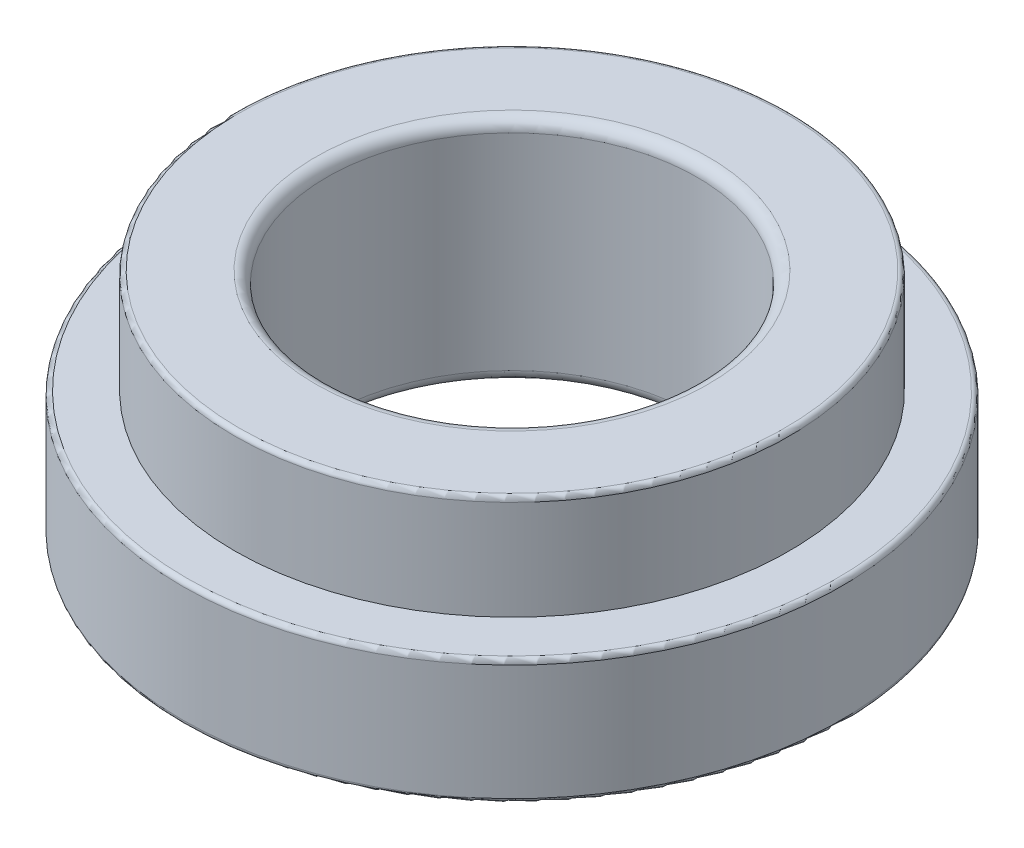
ISO-10303-21;
HEADER;
FILE_DESCRIPTION(('STEP AP214'),'2;1');
FILE_NAME('part.step','',(''),(''),'','','');
FILE_SCHEMA(('AUTOMOTIVE_DESIGN { 1 0 10303 214 1 1 1 1 }'));
ENDSEC;
DATA;
#1=APPLICATION_CONTEXT('core data for automotive mechanical design processes');
#2=APPLICATION_PROTOCOL_DEFINITION('international standard','automotive_design',2000,#1);
#3=PRODUCT_CONTEXT('',#1,'mechanical');
#4=PRODUCT('Part','Part','',(#3));
#5=PRODUCT_RELATED_PRODUCT_CATEGORY('part','',(#4));
#6=PRODUCT_DEFINITION_FORMATION('','',#4);
#7=PRODUCT_DEFINITION_CONTEXT('part definition',#1,'design');
#8=PRODUCT_DEFINITION('design','',#6,#7);
#9=PRODUCT_DEFINITION_SHAPE('','',#8);
#10=(LENGTH_UNIT() NAMED_UNIT(*) SI_UNIT(.MILLI.,.METRE.));
#11=(NAMED_UNIT(*) PLANE_ANGLE_UNIT() SI_UNIT($,.RADIAN.));
#12=(NAMED_UNIT(*) SI_UNIT($,.STERADIAN.) SOLID_ANGLE_UNIT());
#13=UNCERTAINTY_MEASURE_WITH_UNIT(LENGTH_MEASURE(1.E-05),#10,'distance_accuracy_value','');
#14=(GEOMETRIC_REPRESENTATION_CONTEXT(3) GLOBAL_UNCERTAINTY_ASSIGNED_CONTEXT((#13)) GLOBAL_UNIT_ASSIGNED_CONTEXT((#10,
#11,#12)) REPRESENTATION_CONTEXT('',''));
#15=CARTESIAN_POINT('',(0.,0.,0.));
#16=DIRECTION('',(0.,0.,1.));
#17=DIRECTION('',(1.,0.,0.));
#18=AXIS2_PLACEMENT_3D('',#15,#16,#17);
#19=CARTESIAN_POINT('',(0.,4.95,0.));
#20=DIRECTION('',(0.,-1.,0.));
#21=DIRECTION('',(0.,0.,-1.));
#22=AXIS2_PLACEMENT_3D('',#19,#20,#21);
#23=CYLINDRICAL_SURFACE('',#22,7.125);
#24=CARTESIAN_POINT('',(0.,2.6,0.));
#25=DIRECTION('',(0.,1.,0.));
#26=DIRECTION('',(0.,0.,1.));
#27=AXIS2_PLACEMENT_3D('',#24,#25,#26);
#28=CIRCLE('',#27,7.125);
#29=CARTESIAN_POINT('',(0.,2.6,-7.125));
#30=VERTEX_POINT('',#29);
#31=EDGE_CURVE('E62',#30,#30,#28,.F.);
#32=CARTESIAN_POINT('',(0.,0.1,0.));
#33=DIRECTION('',(0.,1.,0.));
#34=DIRECTION('',(0.,0.,1.));
#35=AXIS2_PLACEMENT_3D('',#32,#33,#34);
#36=CIRCLE('',#35,7.125);
#37=CARTESIAN_POINT('',(0.,0.0999999999999994,-7.125));
#38=VERTEX_POINT('',#37);
#39=EDGE_CURVE('E65',#38,#38,#36,.T.);
#40=CARTESIAN_POINT('',(0.,2.6,-7.125));
#41=CARTESIAN_POINT('',(0.,2.57395833333333,-7.125));
#42=CARTESIAN_POINT('',(0.,2.54791666666667,-7.125));
#43=CARTESIAN_POINT('',(0.,2.49583333333333,-7.125));
#44=CARTESIAN_POINT('',(0.,2.46979166666667,-7.125));
#45=CARTESIAN_POINT('',(0.,2.41770833333333,-7.125));
#46=CARTESIAN_POINT('',(0.,2.39166666666667,-7.125));
#47=CARTESIAN_POINT('',(0.,2.33958333333333,-7.125));
#48=CARTESIAN_POINT('',(0.,2.31354166666667,-7.125));
#49=CARTESIAN_POINT('',(0.,2.26145833333333,-7.125));
#50=CARTESIAN_POINT('',(0.,2.23541666666667,-7.125));
#51=CARTESIAN_POINT('',(0.,2.18333333333333,-7.125));
#52=CARTESIAN_POINT('',(0.,2.15729166666667,-7.125));
#53=CARTESIAN_POINT('',(0.,2.10520833333333,-7.125));
#54=CARTESIAN_POINT('',(0.,2.07916666666667,-7.125));
#55=CARTESIAN_POINT('',(0.,2.02708333333333,-7.125));
#56=CARTESIAN_POINT('',(0.,2.00104166666667,-7.125));
#57=CARTESIAN_POINT('',(0.,1.94895833333333,-7.125));
#58=CARTESIAN_POINT('',(0.,1.92291666666667,-7.125));
#59=CARTESIAN_POINT('',(0.,1.87083333333333,-7.125));
#60=CARTESIAN_POINT('',(0.,1.84479166666667,-7.125));
#61=CARTESIAN_POINT('',(0.,1.79270833333333,-7.125));
#62=CARTESIAN_POINT('',(0.,1.76666666666667,-7.125));
#63=CARTESIAN_POINT('',(0.,1.71458333333333,-7.125));
#64=CARTESIAN_POINT('',(0.,1.68854166666667,-7.125));
#65=CARTESIAN_POINT('',(0.,1.63645833333333,-7.125));
#66=CARTESIAN_POINT('',(0.,1.61041666666667,-7.125));
#67=CARTESIAN_POINT('',(0.,1.55833333333333,-7.125));
#68=CARTESIAN_POINT('',(0.,1.53229166666667,-7.125));
#69=CARTESIAN_POINT('',(0.,1.48020833333333,-7.125));
#70=CARTESIAN_POINT('',(0.,1.45416666666667,-7.125));
#71=CARTESIAN_POINT('',(0.,1.40208333333333,-7.125));
#72=CARTESIAN_POINT('',(0.,1.37604166666667,-7.125));
#73=CARTESIAN_POINT('',(0.,1.32395833333333,-7.125));
#74=CARTESIAN_POINT('',(0.,1.29791666666667,-7.125));
#75=CARTESIAN_POINT('',(0.,1.24583333333333,-7.125));
#76=CARTESIAN_POINT('',(0.,1.21979166666667,-7.125));
#77=CARTESIAN_POINT('',(0.,1.16770833333333,-7.125));
#78=CARTESIAN_POINT('',(0.,1.14166666666667,-7.125));
#79=CARTESIAN_POINT('',(0.,1.08958333333333,-7.125));
#80=CARTESIAN_POINT('',(0.,1.06354166666667,-7.125));
#81=CARTESIAN_POINT('',(0.,1.01145833333333,-7.125));
#82=CARTESIAN_POINT('',(0.,0.985416666666667,-7.125));
#83=CARTESIAN_POINT('',(0.,0.933333333333333,-7.125));
#84=CARTESIAN_POINT('',(0.,0.907291666666667,-7.125));
#85=CARTESIAN_POINT('',(0.,0.855208333333333,-7.125));
#86=CARTESIAN_POINT('',(0.,0.829166666666667,-7.125));
#87=CARTESIAN_POINT('',(0.,0.777083333333333,-7.125));
#88=CARTESIAN_POINT('',(0.,0.751041666666667,-7.125));
#89=CARTESIAN_POINT('',(0.,0.698958333333333,-7.125));
#90=CARTESIAN_POINT('',(0.,0.672916666666667,-7.125));
#91=CARTESIAN_POINT('',(0.,0.620833333333333,-7.125));
#92=CARTESIAN_POINT('',(0.,0.594791666666666,-7.125));
#93=CARTESIAN_POINT('',(0.,0.542708333333333,-7.125));
#94=CARTESIAN_POINT('',(0.,0.516666666666666,-7.125));
#95=CARTESIAN_POINT('',(0.,0.464583333333333,-7.125));
#96=CARTESIAN_POINT('',(0.,0.438541666666666,-7.125));
#97=CARTESIAN_POINT('',(0.,0.386458333333333,-7.125));
#98=CARTESIAN_POINT('',(0.,0.360416666666666,-7.125));
#99=CARTESIAN_POINT('',(0.,0.308333333333333,-7.125));
#100=CARTESIAN_POINT('',(0.,0.282291666666666,-7.125));
#101=CARTESIAN_POINT('',(0.,0.230208333333333,-7.125));
#102=CARTESIAN_POINT('',(0.,0.204166666666666,-7.125));
#103=CARTESIAN_POINT('',(0.,0.152083333333333,-7.125));
#104=CARTESIAN_POINT('',(0.,0.126041666666666,-7.125));
#105=CARTESIAN_POINT('',(0.,0.0999999999999994,-7.125));
#106=B_SPLINE_CURVE_WITH_KNOTS('',3,(#40,#41,#42,#43,#44,#45,#46,#47,#48,#49,#50,#51,#52,#53,
#54,#55,#56,#57,#58,#59,#60,#61,#62,#63,#64,#65,#66,#67,#68,#69,#70,#71,#72,#73,#74,#75,#76,#77,
#78,#79,#80,#81,#82,#83,#84,#85,#86,#87,#88,#89,#90,#91,#92,#93,#94,#95,#96,#97,#98,#99,#100,
#101,#102,#103,#104,#105),.UNSPECIFIED.,.F.,.F.,(4,2,2,2,2,2,2,2,2,2,2,2,2,2,2,2,2,2,2,2,2,2,2,
2,2,2,2,2,2,2,2,2,4),(0.,0.0781250000000001,0.15625,0.234375,0.3125,0.390625,0.46875,0.546875,
0.625000000000001,0.703125000000001,0.781250000000001,0.859375,0.9375,1.015625,1.09375,1.171875,
1.25,1.328125,1.40625,1.484375,1.5625,1.640625,1.71875,1.796875,1.875,1.953125,2.03125,2.109375,
2.1875,2.265625,2.34375,2.421875,2.5),.UNSPECIFIED.);
#107=EDGE_CURVE('BSEAM39',#30,#38,#106,.T.);
#108=ORIENTED_EDGE('',*,*,#31,.T.);
#109=ORIENTED_EDGE('',*,*,#39,.T.);
#110=ORIENTED_EDGE('',*,*,#107,.T.);
#111=ORIENTED_EDGE('',*,*,#107,.F.);
#112=EDGE_LOOP('',(#108,#110,#109,#111));
#113=FACE_BOUND('',#112,.T.);
#114=ADVANCED_FACE('F39',(#113),#23,.T.);
#115=CARTESIAN_POINT('',(0.,4.95,0.));
#116=DIRECTION('',(0.,1.,0.));
#117=DIRECTION('',(0.,0.,1.));
#118=AXIS2_PLACEMENT_3D('',#115,#116,#117);
#119=PLANE('',#118);
#120=CARTESIAN_POINT('',(0.,4.95,0.));
#121=DIRECTION('',(0.,1.,0.));
#122=DIRECTION('',(0.,0.,1.));
#123=AXIS2_PLACEMENT_3D('',#120,#121,#122);
#124=CIRCLE('',#123,4.25);
#125=CARTESIAN_POINT('',(0.,4.95,4.25));
#126=VERTEX_POINT('',#125);
#127=EDGE_CURVE('E46',#126,#126,#124,.F.);
#128=ORIENTED_EDGE('',*,*,#127,.T.);
#129=EDGE_LOOP('',(#128));
#130=FACE_BOUND('',#129,.T.);
#131=CARTESIAN_POINT('',(0.,4.95,0.));
#132=DIRECTION('',(0.,1.,0.));
#133=DIRECTION('',(0.,0.,1.));
#134=AXIS2_PLACEMENT_3D('',#131,#132,#133);
#135=CIRCLE('',#134,5.89881953293693);
#136=CARTESIAN_POINT('',(0.,4.95,5.89881953293693));
#137=VERTEX_POINT('',#136);
#138=EDGE_CURVE('E74',#137,#137,#135,.T.);
#139=ORIENTED_EDGE('',*,*,#138,.T.);
#140=EDGE_LOOP('',(#139));
#141=FACE_BOUND('',#140,.T.);
#142=ADVANCED_FACE('F99',(#130,#141),#119,.T.);
#143=CARTESIAN_POINT('',(0.,0.,0.));
#144=DIRECTION('',(0.,1.,0.));
#145=DIRECTION('',(0.,0.,1.));
#146=AXIS2_PLACEMENT_3D('',#143,#144,#145);
#147=PLANE('',#146);
#148=CARTESIAN_POINT('',(0.,0.,0.));
#149=DIRECTION('',(0.,1.,0.));
#150=DIRECTION('',(0.,0.,1.));
#151=AXIS2_PLACEMENT_3D('',#148,#149,#150);
#152=CIRCLE('',#151,4.25);
#153=CARTESIAN_POINT('',(0.,0.,4.25));
#154=VERTEX_POINT('',#153);
#155=EDGE_CURVE('E10',#154,#154,#152,.T.);
#156=ORIENTED_EDGE('',*,*,#155,.T.);
#157=EDGE_LOOP('',(#156));
#158=FACE_BOUND('',#157,.T.);
#159=CARTESIAN_POINT('',(0.,0.,0.));
#160=DIRECTION('',(0.,1.,0.));
#161=DIRECTION('',(0.,0.,1.));
#162=AXIS2_PLACEMENT_3D('',#159,#160,#161);
#163=CIRCLE('',#162,7.025);
#164=CARTESIAN_POINT('',(0.,0.,7.025));
#165=VERTEX_POINT('',#164);
#166=EDGE_CURVE('E59',#165,#165,#163,.F.);
#167=ORIENTED_EDGE('',*,*,#166,.T.);
#168=EDGE_LOOP('',(#167));
#169=FACE_BOUND('',#168,.T.);
#170=ADVANCED_FACE('F96',(#158,#169),#147,.F.);
#171=CARTESIAN_POINT('',(0.,-7.3,0.));
#172=DIRECTION('',(0.,1.,0.));
#173=DIRECTION('',(0.,0.,1.));
#174=AXIS2_PLACEMENT_3D('',#171,#172,#173);
#175=CYLINDRICAL_SURFACE('',#174,4.);
#176=CARTESIAN_POINT('',(0.,4.7,0.));
#177=DIRECTION('',(0.,1.,0.));
#178=DIRECTION('',(0.,0.,1.));
#179=AXIS2_PLACEMENT_3D('',#176,#177,#178);
#180=CIRCLE('',#179,4.);
#181=CARTESIAN_POINT('',(0.,4.7,4.));
#182=VERTEX_POINT('',#181);
#183=EDGE_CURVE('E50',#182,#182,#180,.T.);
#184=ORIENTED_EDGE('',*,*,#183,.T.);
#185=EDGE_LOOP('',(#184));
#186=FACE_BOUND('',#185,.T.);
#187=CARTESIAN_POINT('',(0.,0.25,0.));
#188=DIRECTION('',(0.,1.,0.));
#189=DIRECTION('',(0.,0.,1.));
#190=AXIS2_PLACEMENT_3D('',#187,#188,#189);
#191=CIRCLE('',#190,4.);
#192=CARTESIAN_POINT('',(0.,0.25,4.));
#193=VERTEX_POINT('',#192);
#194=EDGE_CURVE('E54',#193,#193,#191,.F.);
#195=ORIENTED_EDGE('',*,*,#194,.T.);
#196=EDGE_LOOP('',(#195));
#197=FACE_BOUND('',#196,.T.);
#198=ADVANCED_FACE('F85',(#186,#197),#175,.F.);
#199=CARTESIAN_POINT('',(0.,2.7,0.));
#200=DIRECTION('',(0.,1.,0.));
#201=DIRECTION('',(0.,0.,1.));
#202=AXIS2_PLACEMENT_3D('',#199,#200,#201);
#203=PLANE('',#202);
#204=CARTESIAN_POINT('',(0.,2.7,0.));
#205=DIRECTION('',(0.,1.,0.));
#206=DIRECTION('',(0.,0.,1.));
#207=AXIS2_PLACEMENT_3D('',#204,#205,#206);
#208=CIRCLE('',#207,7.025);
#209=CARTESIAN_POINT('',(0.,2.7,7.025));
#210=VERTEX_POINT('',#209);
#211=EDGE_CURVE('E68',#210,#210,#208,.T.);
#212=ORIENTED_EDGE('',*,*,#211,.T.);
#213=EDGE_LOOP('',(#212));
#214=FACE_BOUND('',#213,.T.);
#215=CARTESIAN_POINT('',(0.,2.7,0.));
#216=DIRECTION('',(0.,1.,0.));
#217=DIRECTION('',(0.,0.,1.));
#218=AXIS2_PLACEMENT_3D('',#215,#216,#217);
#219=CIRCLE('',#218,5.99881953293693);
#220=CARTESIAN_POINT('',(0.,2.7,5.99881953293693));
#221=VERTEX_POINT('',#220);
#222=EDGE_CURVE('E77',#221,#221,#219,.T.);
#223=ORIENTED_EDGE('',*,*,#222,.F.);
#224=EDGE_LOOP('',(#223));
#225=FACE_BOUND('',#224,.T.);
#226=ADVANCED_FACE('F83',(#214,#225),#203,.T.);
#227=CARTESIAN_POINT('',(0.,2.7,0.));
#228=DIRECTION('',(0.,1.,0.));
#229=DIRECTION('',(0.,0.,1.));
#230=AXIS2_PLACEMENT_3D('',#227,#228,#229);
#231=CYLINDRICAL_SURFACE('',#230,5.99881953293693);
#232=CARTESIAN_POINT('',(0.,4.85,0.));
#233=DIRECTION('',(0.,1.,0.));
#234=DIRECTION('',(0.,0.,1.));
#235=AXIS2_PLACEMENT_3D('',#232,#233,#234);
#236=CIRCLE('',#235,5.99881953293693);
#237=CARTESIAN_POINT('',(0.,4.85,5.99881953293693));
#238=VERTEX_POINT('',#237);
#239=EDGE_CURVE('E71',#238,#238,#236,.F.);
#240=ORIENTED_EDGE('',*,*,#239,.T.);
#241=EDGE_LOOP('',(#240));
#242=FACE_BOUND('',#241,.T.);
#243=ORIENTED_EDGE('',*,*,#222,.T.);
#244=EDGE_LOOP('',(#243));
#245=FACE_BOUND('',#244,.T.);
#246=ADVANCED_FACE('F81',(#242,#245),#231,.T.);
#247=CARTESIAN_POINT('',(0.,4.85,0.));
#248=DIRECTION('',(0.,1.,0.));
#249=DIRECTION('',(0.,0.,1.));
#250=AXIS2_PLACEMENT_3D('',#247,#248,#249);
#251=TOROIDAL_SURFACE('',#250,5.89881953293693,0.1);
#252=ORIENTED_EDGE('',*,*,#239,.F.);
#253=EDGE_LOOP('',(#252));
#254=FACE_BOUND('',#253,.T.);
#255=ORIENTED_EDGE('',*,*,#138,.F.);
#256=EDGE_LOOP('',(#255));
#257=FACE_BOUND('',#256,.T.);
#258=ADVANCED_FACE('F92',(#254,#257),#251,.T.);
#259=CARTESIAN_POINT('',(0.,2.6,0.));
#260=DIRECTION('',(0.,1.,0.));
#261=DIRECTION('',(0.,0.,1.));
#262=AXIS2_PLACEMENT_3D('',#259,#260,#261);
#263=TOROIDAL_SURFACE('',#262,7.025,0.1);
#264=ORIENTED_EDGE('',*,*,#31,.F.);
#265=EDGE_LOOP('',(#264));
#266=FACE_BOUND('',#265,.T.);
#267=ORIENTED_EDGE('',*,*,#211,.F.);
#268=EDGE_LOOP('',(#267));
#269=FACE_BOUND('',#268,.T.);
#270=ADVANCED_FACE('F111',(#266,#269),#263,.T.);
#271=CARTESIAN_POINT('',(0.,0.1,0.));
#272=DIRECTION('',(0.,1.,0.));
#273=DIRECTION('',(0.,0.,1.));
#274=AXIS2_PLACEMENT_3D('',#271,#272,#273);
#275=TOROIDAL_SURFACE('',#274,7.025,0.1);
#276=ORIENTED_EDGE('',*,*,#166,.F.);
#277=EDGE_LOOP('',(#276));
#278=FACE_BOUND('',#277,.T.);
#279=ORIENTED_EDGE('',*,*,#39,.F.);
#280=EDGE_LOOP('',(#279));
#281=FACE_BOUND('',#280,.T.);
#282=ADVANCED_FACE('F115',(#278,#281),#275,.T.);
#283=CARTESIAN_POINT('',(0.,4.7,0.));
#284=DIRECTION('',(0.,1.,0.));
#285=DIRECTION('',(0.,0.,1.));
#286=AXIS2_PLACEMENT_3D('',#283,#284,#285);
#287=TOROIDAL_SURFACE('',#286,4.25,0.25);
#288=ORIENTED_EDGE('',*,*,#127,.F.);
#289=EDGE_LOOP('',(#288));
#290=FACE_BOUND('',#289,.T.);
#291=ORIENTED_EDGE('',*,*,#183,.F.);
#292=EDGE_LOOP('',(#291));
#293=FACE_BOUND('',#292,.T.);
#294=ADVANCED_FACE('F118',(#290,#293),#287,.T.);
#295=CARTESIAN_POINT('',(0.,0.25,0.));
#296=DIRECTION('',(0.,1.,0.));
#297=DIRECTION('',(0.,0.,1.));
#298=AXIS2_PLACEMENT_3D('',#295,#296,#297);
#299=TOROIDAL_SURFACE('',#298,4.25,0.25);
#300=ORIENTED_EDGE('',*,*,#194,.F.);
#301=EDGE_LOOP('',(#300));
#302=FACE_BOUND('',#301,.T.);
#303=ORIENTED_EDGE('',*,*,#155,.F.);
#304=EDGE_LOOP('',(#303));
#305=FACE_BOUND('',#304,.T.);
#306=ADVANCED_FACE('F41',(#302,#305),#299,.T.);
#307=CLOSED_SHELL('',(#114,#142,#170,#198,#226,#246,#258,#270,#282,#294,#306));
#308=MANIFOLD_SOLID_BREP('B2',#307);
#309=ADVANCED_BREP_SHAPE_REPRESENTATION('',(#18,#308),#14);
#310=SHAPE_DEFINITION_REPRESENTATION(#9,#309);
ENDSEC;
END-ISO-10303-21;
